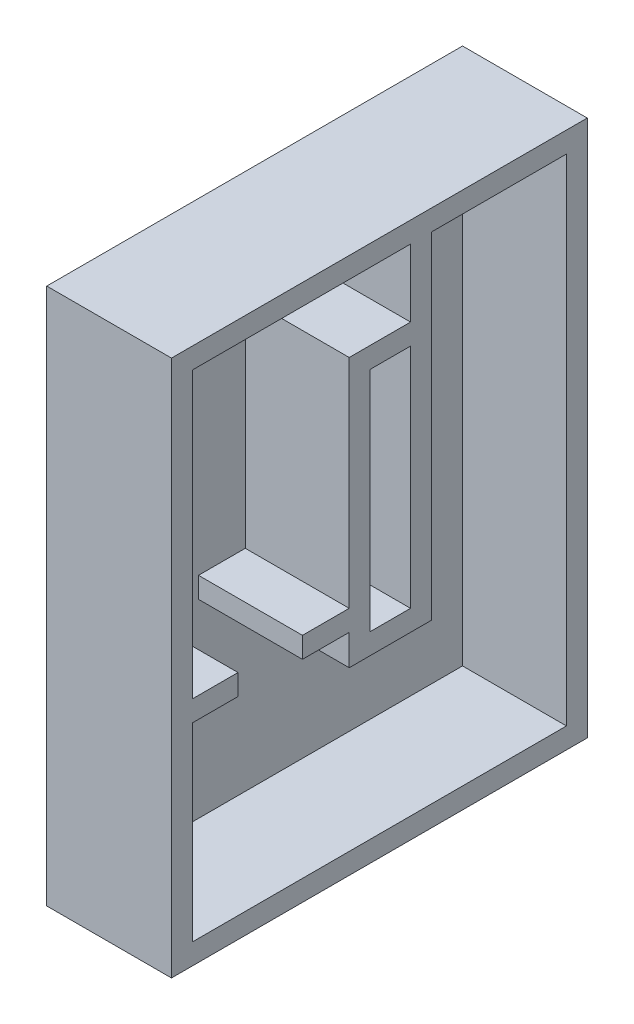
ISO-10303-21;
HEADER;
FILE_DESCRIPTION(('STEP AP214'),'2;1');
FILE_NAME('part.step','',(''),(''),'','','');
FILE_SCHEMA(('AUTOMOTIVE_DESIGN { 1 0 10303 214 1 1 1 1 }'));
ENDSEC;
DATA;
#1=APPLICATION_CONTEXT('core data for automotive mechanical design processes');
#2=APPLICATION_PROTOCOL_DEFINITION('international standard','automotive_design',2000,#1);
#3=PRODUCT_CONTEXT('',#1,'mechanical');
#4=PRODUCT('Part','Part','',(#3));
#5=PRODUCT_RELATED_PRODUCT_CATEGORY('part','',(#4));
#6=PRODUCT_DEFINITION_FORMATION('','',#4);
#7=PRODUCT_DEFINITION_CONTEXT('part definition',#1,'design');
#8=PRODUCT_DEFINITION('design','',#6,#7);
#9=PRODUCT_DEFINITION_SHAPE('','',#8);
#10=(LENGTH_UNIT() NAMED_UNIT(*) SI_UNIT(.MILLI.,.METRE.));
#11=(NAMED_UNIT(*) PLANE_ANGLE_UNIT() SI_UNIT($,.RADIAN.));
#12=(NAMED_UNIT(*) SI_UNIT($,.STERADIAN.) SOLID_ANGLE_UNIT());
#13=UNCERTAINTY_MEASURE_WITH_UNIT(LENGTH_MEASURE(1.E-05),#10,'distance_accuracy_value','');
#14=(GEOMETRIC_REPRESENTATION_CONTEXT(3) GLOBAL_UNCERTAINTY_ASSIGNED_CONTEXT((#13)) GLOBAL_UNIT_ASSIGNED_CONTEXT((#10,
#11,#12)) REPRESENTATION_CONTEXT('',''));
#15=CARTESIAN_POINT('',(0.,0.,0.));
#16=DIRECTION('',(0.,0.,1.));
#17=DIRECTION('',(1.,0.,0.));
#18=AXIS2_PLACEMENT_3D('',#15,#16,#17);
#19=CARTESIAN_POINT('',(2.,0.,0.));
#20=DIRECTION('',(1.,0.,0.));
#21=DIRECTION('',(0.,0.,-1.));
#22=AXIS2_PLACEMENT_3D('',#19,#20,#21);
#23=PLANE('',#22);
#24=DIRECTION('',(0.,1.,0.));
#25=VECTOR('',#24,1.);
#26=CARTESIAN_POINT('',(2.,-3.575,13.6));
#27=LINE('',#26,#25);
#28=CARTESIAN_POINT('',(2.,-5.575,13.6));
#29=VERTEX_POINT('',#28);
#30=CARTESIAN_POINT('',(2.,-3.575,13.6));
#31=VERTEX_POINT('',#30);
#32=EDGE_CURVE('E50',#29,#31,#27,.T.);
#33=ORIENTED_EDGE('',*,*,#32,.F.);
#34=DIRECTION('',(0.,0.,-1.));
#35=VECTOR('',#34,1.);
#36=CARTESIAN_POINT('',(2.,-5.575,18.));
#37=LINE('',#36,#35);
#38=CARTESIAN_POINT('',(2.,-5.575,18.));
#39=VERTEX_POINT('',#38);
#40=EDGE_CURVE('E235',#39,#29,#37,.T.);
#41=ORIENTED_EDGE('',*,*,#40,.F.);
#42=DIRECTION('',(0.,-1.,0.));
#43=VECTOR('',#42,1.);
#44=CARTESIAN_POINT('',(2.,25.825,18.));
#45=LINE('',#44,#43);
#46=CARTESIAN_POINT('',(2.,-23.825,18.));
#47=VERTEX_POINT('',#46);
#48=EDGE_CURVE('E363',#39,#47,#45,.T.);
#49=ORIENTED_EDGE('',*,*,#48,.T.);
#50=DIRECTION('',(0.,0.,-1.));
#51=VECTOR('',#50,1.);
#52=CARTESIAN_POINT('',(2.,-23.825,20.));
#53=LINE('',#52,#51);
#54=CARTESIAN_POINT('',(2.,-23.825,-18.));
#55=VERTEX_POINT('',#54);
#56=EDGE_CURVE('E368',#47,#55,#53,.T.);
#57=ORIENTED_EDGE('',*,*,#56,.T.);
#58=DIRECTION('',(0.,1.,0.));
#59=VECTOR('',#58,1.);
#60=CARTESIAN_POINT('',(2.,25.825,-18.));
#61=LINE('',#60,#59);
#62=CARTESIAN_POINT('',(2.,23.825,-18.));
#63=VERTEX_POINT('',#62);
#64=EDGE_CURVE('E346',#55,#63,#61,.T.);
#65=ORIENTED_EDGE('',*,*,#64,.T.);
#66=DIRECTION('',(0.,0.,1.));
#67=VECTOR('',#66,1.);
#68=CARTESIAN_POINT('',(2.,23.825,20.));
#69=LINE('',#68,#67);
#70=CARTESIAN_POINT('',(2.,23.825,-5.00000000000005));
#71=VERTEX_POINT('',#70);
#72=EDGE_CURVE('E360',#63,#71,#69,.T.);
#73=ORIENTED_EDGE('',*,*,#72,.T.);
#74=DIRECTION('',(0.,1.,0.));
#75=VECTOR('',#74,1.);
#76=CARTESIAN_POINT('',(2.,23.825,-5.00000000000005));
#77=LINE('',#76,#75);
#78=CARTESIAN_POINT('',(2.,-8.52500000000002,-5.00000000000003));
#79=VERTEX_POINT('',#78);
#80=EDGE_CURVE('E314',#79,#71,#77,.T.);
#81=ORIENTED_EDGE('',*,*,#80,.F.);
#82=DIRECTION('',(0.,0.,-1.));
#83=VECTOR('',#82,1.);
#84=CARTESIAN_POINT('',(2.,-8.52500000000002,2.90000000000001));
#85=LINE('',#84,#83);
#86=CARTESIAN_POINT('',(2.,-8.52500000000002,2.90000000000001));
#87=VERTEX_POINT('',#86);
#88=EDGE_CURVE('E311',#87,#79,#85,.T.);
#89=ORIENTED_EDGE('',*,*,#88,.F.);
#90=DIRECTION('',(0.,-1.,0.));
#91=VECTOR('',#90,1.);
#92=CARTESIAN_POINT('',(2.,-5.575,2.90000000000001));
#93=LINE('',#92,#91);
#94=CARTESIAN_POINT('',(2.,-5.575,2.90000000000001));
#95=VERTEX_POINT('',#94);
#96=EDGE_CURVE('E308',#95,#87,#93,.T.);
#97=ORIENTED_EDGE('',*,*,#96,.F.);
#98=DIRECTION('',(0.,0.,-1.));
#99=VECTOR('',#98,1.);
#100=CARTESIAN_POINT('',(2.,-5.575,7.40000000000001));
#101=LINE('',#100,#99);
#102=CARTESIAN_POINT('',(2.,-5.575,7.40000000000001));
#103=VERTEX_POINT('',#102);
#104=EDGE_CURVE('E305',#103,#95,#101,.T.);
#105=ORIENTED_EDGE('',*,*,#104,.F.);
#106=DIRECTION('',(0.,-1.,0.));
#107=VECTOR('',#106,1.);
#108=CARTESIAN_POINT('',(2.,-3.575,7.40000000000001));
#109=LINE('',#108,#107);
#110=CARTESIAN_POINT('',(2.,-3.575,7.40000000000001));
#111=VERTEX_POINT('',#110);
#112=EDGE_CURVE('E302',#111,#103,#109,.T.);
#113=ORIENTED_EDGE('',*,*,#112,.F.);
#114=DIRECTION('',(0.,0.,1.));
#115=VECTOR('',#114,1.);
#116=CARTESIAN_POINT('',(2.,-3.575,7.40000000000001));
#117=LINE('',#116,#115);
#118=CARTESIAN_POINT('',(2.,-3.575,2.90000000000001));
#119=VERTEX_POINT('',#118);
#120=EDGE_CURVE('E299',#119,#111,#117,.T.);
#121=ORIENTED_EDGE('',*,*,#120,.F.);
#122=DIRECTION('',(0.,-1.,0.));
#123=VECTOR('',#122,1.);
#124=CARTESIAN_POINT('',(2.,17.325,2.89999999999999));
#125=LINE('',#124,#123);
#126=CARTESIAN_POINT('',(2.,17.325,2.89999999999999));
#127=VERTEX_POINT('',#126);
#128=EDGE_CURVE('E296',#127,#119,#125,.T.);
#129=ORIENTED_EDGE('',*,*,#128,.F.);
#130=DIRECTION('',(0.,0.,1.));
#131=VECTOR('',#130,1.);
#132=CARTESIAN_POINT('',(2.,17.325,2.89999999999999));
#133=LINE('',#132,#131);
#134=CARTESIAN_POINT('',(2.,17.325,-3.00000000000005));
#135=VERTEX_POINT('',#134);
#136=EDGE_CURVE('E319',#135,#127,#133,.T.);
#137=ORIENTED_EDGE('',*,*,#136,.F.);
#138=DIRECTION('',(0.,-1.,0.));
#139=VECTOR('',#138,1.);
#140=CARTESIAN_POINT('',(2.,23.825,-3.00000000000005));
#141=LINE('',#140,#139);
#142=CARTESIAN_POINT('',(2.,23.825,-3.00000000000005));
#143=VERTEX_POINT('',#142);
#144=EDGE_CURVE('E316',#143,#135,#141,.T.);
#145=ORIENTED_EDGE('',*,*,#144,.F.);
#146=CARTESIAN_POINT('',(2.,23.825,18.));
#147=VERTEX_POINT('',#146);
#148=EDGE_CURVE('E349',#143,#147,#69,.T.);
#149=ORIENTED_EDGE('',*,*,#148,.T.);
#150=CARTESIAN_POINT('',(2.,-3.575,18.));
#151=VERTEX_POINT('',#150);
#152=EDGE_CURVE('E366',#147,#151,#45,.T.);
#153=ORIENTED_EDGE('',*,*,#152,.T.);
#154=DIRECTION('',(0.,0.,1.));
#155=VECTOR('',#154,1.);
#156=CARTESIAN_POINT('',(2.,-3.575,18.));
#157=LINE('',#156,#155);
#158=EDGE_CURVE('E55',#31,#151,#157,.T.);
#159=ORIENTED_EDGE('',*,*,#158,.F.);
#160=EDGE_LOOP('',(#33,#41,#49,#57,#65,#73,#81,#89,#97,#105,#113,#121,#129,#137,#145,#149,#153,#159));
#161=FACE_BOUND('',#160,.T.);
#162=ADVANCED_FACE('F35',(#161),#23,.T.);
#163=CARTESIAN_POINT('',(12.,25.825,18.));
#164=DIRECTION('',(0.,0.,-1.));
#165=DIRECTION('',(0.,1.,0.));
#166=AXIS2_PLACEMENT_3D('',#163,#164,#165);
#167=PLANE('',#166);
#168=ORIENTED_EDGE('',*,*,#48,.F.);
#169=DIRECTION('',(-1.,0.,0.));
#170=VECTOR('',#169,1.);
#171=CARTESIAN_POINT('',(46.645093447702,-5.575,18.));
#172=LINE('',#171,#170);
#173=CARTESIAN_POINT('',(12.,-5.575,18.));
#174=VERTEX_POINT('',#173);
#175=EDGE_CURVE('E238',#174,#39,#172,.T.);
#176=ORIENTED_EDGE('',*,*,#175,.F.);
#177=DIRECTION('',(0.,-1.,0.));
#178=VECTOR('',#177,1.);
#179=CARTESIAN_POINT('',(12.,25.825,18.));
#180=LINE('',#179,#178);
#181=CARTESIAN_POINT('',(12.,-23.825,18.));
#182=VERTEX_POINT('',#181);
#183=EDGE_CURVE('E378',#174,#182,#180,.T.);
#184=ORIENTED_EDGE('',*,*,#183,.T.);
#185=DIRECTION('',(-1.,0.,0.));
#186=VECTOR('',#185,1.);
#187=CARTESIAN_POINT('',(12.,-23.825,18.));
#188=LINE('',#187,#186);
#189=EDGE_CURVE('E358',#182,#47,#188,.T.);
#190=ORIENTED_EDGE('',*,*,#189,.T.);
#191=EDGE_LOOP('',(#168,#176,#184,#190));
#192=FACE_BOUND('',#191,.T.);
#193=ADVANCED_FACE('F433',(#192),#167,.T.);
#194=CARTESIAN_POINT('',(12.,23.825,18.));
#195=VERTEX_POINT('',#194);
#196=CARTESIAN_POINT('',(12.,-3.575,18.));
#197=VERTEX_POINT('',#196);
#198=EDGE_CURVE('E379',#195,#197,#180,.T.);
#199=ORIENTED_EDGE('',*,*,#198,.T.);
#200=DIRECTION('',(-1.,0.,0.));
#201=VECTOR('',#200,1.);
#202=CARTESIAN_POINT('',(46.645093447702,-3.575,18.));
#203=LINE('',#202,#201);
#204=EDGE_CURVE('E218',#197,#151,#203,.T.);
#205=ORIENTED_EDGE('',*,*,#204,.T.);
#206=ORIENTED_EDGE('',*,*,#152,.F.);
#207=DIRECTION('',(-1.,0.,0.));
#208=VECTOR('',#207,1.);
#209=CARTESIAN_POINT('',(12.,23.825,18.));
#210=LINE('',#209,#208);
#211=EDGE_CURVE('E354',#195,#147,#210,.T.);
#212=ORIENTED_EDGE('',*,*,#211,.F.);
#213=EDGE_LOOP('',(#199,#205,#206,#212));
#214=FACE_BOUND('',#213,.T.);
#215=ADVANCED_FACE('F439',(#214),#167,.T.);
#216=CARTESIAN_POINT('',(12.,23.825,20.));
#217=DIRECTION('',(0.,-1.,0.));
#218=DIRECTION('',(0.,0.,-1.));
#219=AXIS2_PLACEMENT_3D('',#216,#217,#218);
#220=PLANE('',#219);
#221=ORIENTED_EDGE('',*,*,#148,.F.);
#222=DIRECTION('',(-1.,0.,0.));
#223=VECTOR('',#222,1.);
#224=CARTESIAN_POINT('',(46.645093447702,23.825,-3.00000000000005));
#225=LINE('',#224,#223);
#226=CARTESIAN_POINT('',(12.,23.825,-3.00000000000005));
#227=VERTEX_POINT('',#226);
#228=EDGE_CURVE('E326',#227,#143,#225,.T.);
#229=ORIENTED_EDGE('',*,*,#228,.F.);
#230=DIRECTION('',(0.,0.,1.));
#231=VECTOR('',#230,1.);
#232=CARTESIAN_POINT('',(12.,23.825,20.));
#233=LINE('',#232,#231);
#234=EDGE_CURVE('E374',#227,#195,#233,.T.);
#235=ORIENTED_EDGE('',*,*,#234,.T.);
#236=ORIENTED_EDGE('',*,*,#211,.T.);
#237=EDGE_LOOP('',(#221,#229,#235,#236));
#238=FACE_BOUND('',#237,.T.);
#239=ADVANCED_FACE('F503',(#238),#220,.T.);
#240=CARTESIAN_POINT('',(12.,23.825,-18.));
#241=VERTEX_POINT('',#240);
#242=CARTESIAN_POINT('',(12.,23.825,-5.00000000000005));
#243=VERTEX_POINT('',#242);
#244=EDGE_CURVE('E375',#241,#243,#233,.T.);
#245=ORIENTED_EDGE('',*,*,#244,.T.);
#246=DIRECTION('',(-1.,0.,0.));
#247=VECTOR('',#246,1.);
#248=CARTESIAN_POINT('',(46.645093447702,23.825,-5.00000000000005));
#249=LINE('',#248,#247);
#250=EDGE_CURVE('E328',#243,#71,#249,.T.);
#251=ORIENTED_EDGE('',*,*,#250,.T.);
#252=ORIENTED_EDGE('',*,*,#72,.F.);
#253=DIRECTION('',(-1.,0.,0.));
#254=VECTOR('',#253,1.);
#255=CARTESIAN_POINT('',(12.,23.825,-18.));
#256=LINE('',#255,#254);
#257=EDGE_CURVE('E350',#241,#63,#256,.T.);
#258=ORIENTED_EDGE('',*,*,#257,.F.);
#259=EDGE_LOOP('',(#245,#251,#252,#258));
#260=FACE_BOUND('',#259,.T.);
#261=ADVANCED_FACE('F431',(#260),#220,.T.);
#262=CARTESIAN_POINT('',(12.,25.825,-20.));
#263=DIRECTION('',(0.,0.,1.));
#264=DIRECTION('',(0.,-1.,0.));
#265=AXIS2_PLACEMENT_3D('',#262,#263,#264);
#266=PLANE('',#265);
#267=DIRECTION('',(0.,1.,0.));
#268=VECTOR('',#267,1.);
#269=CARTESIAN_POINT('',(0.,25.825,-20.));
#270=LINE('',#269,#268);
#271=CARTESIAN_POINT('',(0.,-25.825,-20.));
#272=VERTEX_POINT('',#271);
#273=CARTESIAN_POINT('',(0.,25.825,-20.));
#274=VERTEX_POINT('',#273);
#275=EDGE_CURVE('E353',#272,#274,#270,.T.);
#276=ORIENTED_EDGE('',*,*,#275,.T.);
#277=DIRECTION('',(-1.,0.,0.));
#278=VECTOR('',#277,1.);
#279=CARTESIAN_POINT('',(12.,25.825,-20.));
#280=LINE('',#279,#278);
#281=CARTESIAN_POINT('',(12.,25.825,-20.));
#282=VERTEX_POINT('',#281);
#283=EDGE_CURVE('E11',#282,#274,#280,.T.);
#284=ORIENTED_EDGE('',*,*,#283,.F.);
#285=DIRECTION('',(0.,1.,0.));
#286=VECTOR('',#285,1.);
#287=CARTESIAN_POINT('',(12.,25.825,-20.));
#288=LINE('',#287,#286);
#289=CARTESIAN_POINT('',(12.,-25.825,-20.));
#290=VERTEX_POINT('',#289);
#291=EDGE_CURVE('E382',#290,#282,#288,.T.);
#292=ORIENTED_EDGE('',*,*,#291,.F.);
#293=DIRECTION('',(-1.,0.,0.));
#294=VECTOR('',#293,1.);
#295=CARTESIAN_POINT('',(12.,-25.825,-20.));
#296=LINE('',#295,#294);
#297=EDGE_CURVE('E392',#290,#272,#296,.T.);
#298=ORIENTED_EDGE('',*,*,#297,.T.);
#299=EDGE_LOOP('',(#276,#284,#292,#298));
#300=FACE_BOUND('',#299,.T.);
#301=ADVANCED_FACE('F37',(#300),#266,.F.);
#302=CARTESIAN_POINT('',(12.,25.825,20.));
#303=DIRECTION('',(0.,-1.,0.));
#304=DIRECTION('',(0.,0.,-1.));
#305=AXIS2_PLACEMENT_3D('',#302,#303,#304);
#306=PLANE('',#305);
#307=DIRECTION('',(0.,0.,1.));
#308=VECTOR('',#307,1.);
#309=CARTESIAN_POINT('',(0.,25.825,20.));
#310=LINE('',#309,#308);
#311=CARTESIAN_POINT('',(0.,25.825,20.));
#312=VERTEX_POINT('',#311);
#313=EDGE_CURVE('E395',#274,#312,#310,.T.);
#314=ORIENTED_EDGE('',*,*,#313,.T.);
#315=DIRECTION('',(-1.,0.,0.));
#316=VECTOR('',#315,1.);
#317=CARTESIAN_POINT('',(12.,25.825,20.));
#318=LINE('',#317,#316);
#319=CARTESIAN_POINT('',(12.,25.825,20.));
#320=VERTEX_POINT('',#319);
#321=EDGE_CURVE('E43',#320,#312,#318,.T.);
#322=ORIENTED_EDGE('',*,*,#321,.F.);
#323=DIRECTION('',(0.,0.,1.));
#324=VECTOR('',#323,1.);
#325=CARTESIAN_POINT('',(12.,25.825,20.));
#326=LINE('',#325,#324);
#327=EDGE_CURVE('E385',#282,#320,#326,.T.);
#328=ORIENTED_EDGE('',*,*,#327,.F.);
#329=ORIENTED_EDGE('',*,*,#283,.T.);
#330=EDGE_LOOP('',(#314,#322,#328,#329));
#331=FACE_BOUND('',#330,.T.);
#332=ADVANCED_FACE('F424',(#331),#306,.F.);
#333=CARTESIAN_POINT('',(12.,25.825,20.));
#334=DIRECTION('',(0.,0.,-1.));
#335=DIRECTION('',(0.,1.,0.));
#336=AXIS2_PLACEMENT_3D('',#333,#334,#335);
#337=PLANE('',#336);
#338=DIRECTION('',(0.,-1.,0.));
#339=VECTOR('',#338,1.);
#340=CARTESIAN_POINT('',(0.,25.825,20.));
#341=LINE('',#340,#339);
#342=CARTESIAN_POINT('',(0.,-25.825,20.));
#343=VERTEX_POINT('',#342);
#344=EDGE_CURVE('E397',#312,#343,#341,.T.);
#345=ORIENTED_EDGE('',*,*,#344,.T.);
#346=DIRECTION('',(-1.,0.,0.));
#347=VECTOR('',#346,1.);
#348=CARTESIAN_POINT('',(12.,-25.825,20.));
#349=LINE('',#348,#347);
#350=CARTESIAN_POINT('',(12.,-25.825,20.));
#351=VERTEX_POINT('',#350);
#352=EDGE_CURVE('E402',#351,#343,#349,.T.);
#353=ORIENTED_EDGE('',*,*,#352,.F.);
#354=DIRECTION('',(0.,-1.,0.));
#355=VECTOR('',#354,1.);
#356=CARTESIAN_POINT('',(12.,25.825,20.));
#357=LINE('',#356,#355);
#358=EDGE_CURVE('E388',#320,#351,#357,.T.);
#359=ORIENTED_EDGE('',*,*,#358,.F.);
#360=ORIENTED_EDGE('',*,*,#321,.T.);
#361=EDGE_LOOP('',(#345,#353,#359,#360));
#362=FACE_BOUND('',#361,.T.);
#363=ADVANCED_FACE('F409',(#362),#337,.F.);
#364=CARTESIAN_POINT('',(12.,-25.825,20.));
#365=DIRECTION('',(0.,1.,0.));
#366=DIRECTION('',(0.,0.,1.));
#367=AXIS2_PLACEMENT_3D('',#364,#365,#366);
#368=PLANE('',#367);
#369=DIRECTION('',(0.,0.,-1.));
#370=VECTOR('',#369,1.);
#371=CARTESIAN_POINT('',(0.,-25.825,20.));
#372=LINE('',#371,#370);
#373=EDGE_CURVE('E386',#343,#272,#372,.T.);
#374=ORIENTED_EDGE('',*,*,#373,.T.);
#375=ORIENTED_EDGE('',*,*,#297,.F.);
#376=DIRECTION('',(0.,0.,-1.));
#377=VECTOR('',#376,1.);
#378=CARTESIAN_POINT('',(12.,-25.825,20.));
#379=LINE('',#378,#377);
#380=EDGE_CURVE('E390',#351,#290,#379,.T.);
#381=ORIENTED_EDGE('',*,*,#380,.F.);
#382=ORIENTED_EDGE('',*,*,#352,.T.);
#383=EDGE_LOOP('',(#374,#375,#381,#382));
#384=FACE_BOUND('',#383,.T.);
#385=ADVANCED_FACE('F418',(#384),#368,.F.);
#386=CARTESIAN_POINT('',(12.,0.,0.));
#387=DIRECTION('',(1.,0.,0.));
#388=DIRECTION('',(0.,0.,-1.));
#389=AXIS2_PLACEMENT_3D('',#386,#387,#388);
#390=PLANE('',#389);
#391=DIRECTION('',(0.,1.,0.));
#392=VECTOR('',#391,1.);
#393=CARTESIAN_POINT('',(12.,25.825,-18.));
#394=LINE('',#393,#392);
#395=CARTESIAN_POINT('',(12.,-23.825,-18.));
#396=VERTEX_POINT('',#395);
#397=EDGE_CURVE('E372',#396,#241,#394,.T.);
#398=ORIENTED_EDGE('',*,*,#397,.F.);
#399=DIRECTION('',(0.,0.,-1.));
#400=VECTOR('',#399,1.);
#401=CARTESIAN_POINT('',(12.,-23.825,20.));
#402=LINE('',#401,#400);
#403=EDGE_CURVE('E359',#182,#396,#402,.T.);
#404=ORIENTED_EDGE('',*,*,#403,.F.);
#405=ORIENTED_EDGE('',*,*,#183,.F.);
#406=DIRECTION('',(0.,0.,-1.));
#407=VECTOR('',#406,1.);
#408=CARTESIAN_POINT('',(12.,-5.575,18.));
#409=LINE('',#408,#407);
#410=CARTESIAN_POINT('',(12.,-5.575,13.6));
#411=VERTEX_POINT('',#410);
#412=EDGE_CURVE('E221',#174,#411,#409,.T.);
#413=ORIENTED_EDGE('',*,*,#412,.T.);
#414=DIRECTION('',(0.,1.,0.));
#415=VECTOR('',#414,1.);
#416=CARTESIAN_POINT('',(12.,-3.575,13.6));
#417=LINE('',#416,#415);
#418=CARTESIAN_POINT('',(12.,-3.575,13.6));
#419=VERTEX_POINT('',#418);
#420=EDGE_CURVE('E210',#411,#419,#417,.T.);
#421=ORIENTED_EDGE('',*,*,#420,.T.);
#422=DIRECTION('',(0.,0.,1.));
#423=VECTOR('',#422,1.);
#424=CARTESIAN_POINT('',(12.,-3.575,18.));
#425=LINE('',#424,#423);
#426=EDGE_CURVE('E216',#419,#197,#425,.T.);
#427=ORIENTED_EDGE('',*,*,#426,.T.);
#428=ORIENTED_EDGE('',*,*,#198,.F.);
#429=ORIENTED_EDGE('',*,*,#234,.F.);
#430=DIRECTION('',(0.,-1.,0.));
#431=VECTOR('',#430,1.);
#432=CARTESIAN_POINT('',(12.,23.825,-3.00000000000005));
#433=LINE('',#432,#431);
#434=CARTESIAN_POINT('',(12.,17.325,-3.00000000000005));
#435=VERTEX_POINT('',#434);
#436=EDGE_CURVE('E252',#227,#435,#433,.T.);
#437=ORIENTED_EDGE('',*,*,#436,.T.);
#438=DIRECTION('',(0.,0.,1.));
#439=VECTOR('',#438,1.);
#440=CARTESIAN_POINT('',(12.,17.325,2.89999999999999));
#441=LINE('',#440,#439);
#442=CARTESIAN_POINT('',(12.,17.325,2.89999999999999));
#443=VERTEX_POINT('',#442);
#444=EDGE_CURVE('E249',#435,#443,#441,.T.);
#445=ORIENTED_EDGE('',*,*,#444,.T.);
#446=DIRECTION('',(0.,-1.,0.));
#447=VECTOR('',#446,1.);
#448=CARTESIAN_POINT('',(12.,17.325,2.89999999999999));
#449=LINE('',#448,#447);
#450=CARTESIAN_POINT('',(12.,-3.575,2.90000000000001));
#451=VERTEX_POINT('',#450);
#452=EDGE_CURVE('E273',#443,#451,#449,.T.);
#453=ORIENTED_EDGE('',*,*,#452,.T.);
#454=DIRECTION('',(0.,0.,1.));
#455=VECTOR('',#454,1.);
#456=CARTESIAN_POINT('',(12.,-3.575,7.40000000000001));
#457=LINE('',#456,#455);
#458=CARTESIAN_POINT('',(12.,-3.575,7.40000000000001));
#459=VERTEX_POINT('',#458);
#460=EDGE_CURVE('E270',#451,#459,#457,.T.);
#461=ORIENTED_EDGE('',*,*,#460,.T.);
#462=DIRECTION('',(0.,-1.,0.));
#463=VECTOR('',#462,1.);
#464=CARTESIAN_POINT('',(12.,-3.575,7.40000000000001));
#465=LINE('',#464,#463);
#466=CARTESIAN_POINT('',(12.,-5.575,7.40000000000001));
#467=VERTEX_POINT('',#466);
#468=EDGE_CURVE('E267',#459,#467,#465,.T.);
#469=ORIENTED_EDGE('',*,*,#468,.T.);
#470=DIRECTION('',(0.,0.,-1.));
#471=VECTOR('',#470,1.);
#472=CARTESIAN_POINT('',(12.,-5.575,7.40000000000001));
#473=LINE('',#472,#471);
#474=CARTESIAN_POINT('',(12.,-5.575,2.90000000000001));
#475=VERTEX_POINT('',#474);
#476=EDGE_CURVE('E264',#467,#475,#473,.T.);
#477=ORIENTED_EDGE('',*,*,#476,.T.);
#478=DIRECTION('',(0.,-1.,0.));
#479=VECTOR('',#478,1.);
#480=CARTESIAN_POINT('',(12.,-5.575,2.90000000000001));
#481=LINE('',#480,#479);
#482=CARTESIAN_POINT('',(12.,-8.52500000000002,2.90000000000001));
#483=VERTEX_POINT('',#482);
#484=EDGE_CURVE('E261',#475,#483,#481,.T.);
#485=ORIENTED_EDGE('',*,*,#484,.T.);
#486=DIRECTION('',(0.,0.,-1.));
#487=VECTOR('',#486,1.);
#488=CARTESIAN_POINT('',(12.,-8.52500000000002,2.90000000000001));
#489=LINE('',#488,#487);
#490=CARTESIAN_POINT('',(12.,-8.52500000000002,-5.00000000000003));
#491=VERTEX_POINT('',#490);
#492=EDGE_CURVE('E258',#483,#491,#489,.T.);
#493=ORIENTED_EDGE('',*,*,#492,.T.);
#494=DIRECTION('',(0.,1.,0.));
#495=VECTOR('',#494,1.);
#496=CARTESIAN_POINT('',(12.,23.825,-5.00000000000005));
#497=LINE('',#496,#495);
#498=EDGE_CURVE('E255',#491,#243,#497,.T.);
#499=ORIENTED_EDGE('',*,*,#498,.T.);
#500=ORIENTED_EDGE('',*,*,#244,.F.);
#501=EDGE_LOOP('',(#398,#404,#405,#413,#421,#427,#428,#429,#437,#445,#453,#461,#469,#477,#485,
#493,#499,#500));
#502=FACE_BOUND('',#501,.T.);
#503=ORIENTED_EDGE('',*,*,#291,.T.);
#504=ORIENTED_EDGE('',*,*,#327,.T.);
#505=ORIENTED_EDGE('',*,*,#358,.T.);
#506=ORIENTED_EDGE('',*,*,#380,.T.);
#507=EDGE_LOOP('',(#503,#504,#505,#506));
#508=FACE_BOUND('',#507,.T.);
#509=DIRECTION('',(0.,-1.,0.));
#510=VECTOR('',#509,1.);
#511=CARTESIAN_POINT('',(12.,15.325,0.899999999999993));
#512=LINE('',#511,#510);
#513=CARTESIAN_POINT('',(12.,15.325,0.899999999999993));
#514=VERTEX_POINT('',#513);
#515=CARTESIAN_POINT('',(12.,-6.52500000000002,0.900000000000008));
#516=VERTEX_POINT('',#515);
#517=EDGE_CURVE('E246',#514,#516,#512,.T.);
#518=ORIENTED_EDGE('',*,*,#517,.F.);
#519=DIRECTION('',(0.,0.,1.));
#520=VECTOR('',#519,1.);
#521=CARTESIAN_POINT('',(12.,15.325,0.899999999999993));
#522=LINE('',#521,#520);
#523=CARTESIAN_POINT('',(12.,15.325,-3.00000000000005));
#524=VERTEX_POINT('',#523);
#525=EDGE_CURVE('E343',#524,#514,#522,.T.);
#526=ORIENTED_EDGE('',*,*,#525,.F.);
#527=DIRECTION('',(0.,1.,0.));
#528=VECTOR('',#527,1.);
#529=CARTESIAN_POINT('',(12.,15.325,-3.00000000000005));
#530=LINE('',#529,#528);
#531=CARTESIAN_POINT('',(12.,-6.52500000000002,-3.00000000000003));
#532=VERTEX_POINT('',#531);
#533=EDGE_CURVE('E228',#532,#524,#530,.T.);
#534=ORIENTED_EDGE('',*,*,#533,.F.);
#535=DIRECTION('',(0.,0.,-1.));
#536=VECTOR('',#535,1.);
#537=CARTESIAN_POINT('',(12.,-6.52500000000002,0.900000000000008));
#538=LINE('',#537,#536);
#539=EDGE_CURVE('E231',#516,#532,#538,.T.);
#540=ORIENTED_EDGE('',*,*,#539,.F.);
#541=EDGE_LOOP('',(#518,#526,#534,#540));
#542=FACE_BOUND('',#541,.T.);
#543=ADVANCED_FACE('F225',(#502,#508,#542),#390,.T.);
#544=CARTESIAN_POINT('',(0.,0.,0.));
#545=DIRECTION('',(1.,0.,0.));
#546=DIRECTION('',(0.,0.,-1.));
#547=AXIS2_PLACEMENT_3D('',#544,#545,#546);
#548=PLANE('',#547);
#549=ORIENTED_EDGE('',*,*,#275,.F.);
#550=ORIENTED_EDGE('',*,*,#373,.F.);
#551=ORIENTED_EDGE('',*,*,#344,.F.);
#552=ORIENTED_EDGE('',*,*,#313,.F.);
#553=EDGE_LOOP('',(#549,#550,#551,#552));
#554=FACE_BOUND('',#553,.T.);
#555=ADVANCED_FACE('F415',(#554),#548,.F.);
#556=CARTESIAN_POINT('',(12.,25.825,-18.));
#557=DIRECTION('',(0.,0.,1.));
#558=DIRECTION('',(0.,-1.,0.));
#559=AXIS2_PLACEMENT_3D('',#556,#557,#558);
#560=PLANE('',#559);
#561=ORIENTED_EDGE('',*,*,#64,.F.);
#562=DIRECTION('',(-1.,0.,0.));
#563=VECTOR('',#562,1.);
#564=CARTESIAN_POINT('',(12.,-23.825,-18.));
#565=LINE('',#564,#563);
#566=EDGE_CURVE('E355',#396,#55,#565,.T.);
#567=ORIENTED_EDGE('',*,*,#566,.F.);
#568=ORIENTED_EDGE('',*,*,#397,.T.);
#569=ORIENTED_EDGE('',*,*,#257,.T.);
#570=EDGE_LOOP('',(#561,#567,#568,#569));
#571=FACE_BOUND('',#570,.T.);
#572=ADVANCED_FACE('F475',(#571),#560,.T.);
#573=CARTESIAN_POINT('',(12.,-23.825,20.));
#574=DIRECTION('',(0.,1.,0.));
#575=DIRECTION('',(0.,0.,1.));
#576=AXIS2_PLACEMENT_3D('',#573,#574,#575);
#577=PLANE('',#576);
#578=ORIENTED_EDGE('',*,*,#56,.F.);
#579=ORIENTED_EDGE('',*,*,#189,.F.);
#580=ORIENTED_EDGE('',*,*,#403,.T.);
#581=ORIENTED_EDGE('',*,*,#566,.T.);
#582=EDGE_LOOP('',(#578,#579,#580,#581));
#583=FACE_BOUND('',#582,.T.);
#584=ADVANCED_FACE('F531',(#583),#577,.T.);
#585=CARTESIAN_POINT('',(46.645093447702,17.325,2.89999999999999));
#586=DIRECTION('',(0.,-1.,0.));
#587=DIRECTION('',(0.,0.,-1.));
#588=AXIS2_PLACEMENT_3D('',#585,#586,#587);
#589=PLANE('',#588);
#590=ORIENTED_EDGE('',*,*,#444,.F.);
#591=DIRECTION('',(-1.,0.,0.));
#592=VECTOR('',#591,1.);
#593=CARTESIAN_POINT('',(46.645093447702,17.325,-3.00000000000005));
#594=LINE('',#593,#592);
#595=EDGE_CURVE('E324',#435,#135,#594,.T.);
#596=ORIENTED_EDGE('',*,*,#595,.T.);
#597=ORIENTED_EDGE('',*,*,#136,.T.);
#598=DIRECTION('',(-1.,0.,0.));
#599=VECTOR('',#598,1.);
#600=CARTESIAN_POINT('',(46.645093447702,17.325,2.89999999999999));
#601=LINE('',#600,#599);
#602=EDGE_CURVE('E321',#443,#127,#601,.T.);
#603=ORIENTED_EDGE('',*,*,#602,.F.);
#604=EDGE_LOOP('',(#590,#596,#597,#603));
#605=FACE_BOUND('',#604,.T.);
#606=ADVANCED_FACE('F536',(#605),#589,.F.);
#607=CARTESIAN_POINT('',(46.645093447702,23.825,-3.00000000000005));
#608=DIRECTION('',(0.,0.,-1.));
#609=DIRECTION('',(0.,1.,0.));
#610=AXIS2_PLACEMENT_3D('',#607,#608,#609);
#611=PLANE('',#610);
#612=ORIENTED_EDGE('',*,*,#436,.F.);
#613=ORIENTED_EDGE('',*,*,#228,.T.);
#614=ORIENTED_EDGE('',*,*,#144,.T.);
#615=ORIENTED_EDGE('',*,*,#595,.F.);
#616=EDGE_LOOP('',(#612,#613,#614,#615));
#617=FACE_BOUND('',#616,.T.);
#618=ADVANCED_FACE('F572',(#617),#611,.F.);
#619=CARTESIAN_POINT('',(46.645093447702,23.825,-5.00000000000005));
#620=DIRECTION('',(0.,0.,1.));
#621=DIRECTION('',(1.,0.,0.));
#622=AXIS2_PLACEMENT_3D('',#619,#620,#621);
#623=PLANE('',#622);
#624=ORIENTED_EDGE('',*,*,#498,.F.);
#625=DIRECTION('',(-1.,0.,0.));
#626=VECTOR('',#625,1.);
#627=CARTESIAN_POINT('',(46.645093447702,-8.52500000000002,-5.00000000000003));
#628=LINE('',#627,#626);
#629=EDGE_CURVE('E331',#491,#79,#628,.T.);
#630=ORIENTED_EDGE('',*,*,#629,.T.);
#631=ORIENTED_EDGE('',*,*,#80,.T.);
#632=ORIENTED_EDGE('',*,*,#250,.F.);
#633=EDGE_LOOP('',(#624,#630,#631,#632));
#634=FACE_BOUND('',#633,.T.);
#635=ADVANCED_FACE('F581',(#634),#623,.F.);
#636=CARTESIAN_POINT('',(46.645093447702,-8.52500000000002,2.90000000000001));
#637=DIRECTION('',(0.,1.,0.));
#638=DIRECTION('',(0.,0.,1.));
#639=AXIS2_PLACEMENT_3D('',#636,#637,#638);
#640=PLANE('',#639);
#641=ORIENTED_EDGE('',*,*,#492,.F.);
#642=DIRECTION('',(-1.,0.,0.));
#643=VECTOR('',#642,1.);
#644=CARTESIAN_POINT('',(46.645093447702,-8.52500000000002,2.90000000000001));
#645=LINE('',#644,#643);
#646=EDGE_CURVE('E333',#483,#87,#645,.T.);
#647=ORIENTED_EDGE('',*,*,#646,.T.);
#648=ORIENTED_EDGE('',*,*,#88,.T.);
#649=ORIENTED_EDGE('',*,*,#629,.F.);
#650=EDGE_LOOP('',(#641,#647,#648,#649));
#651=FACE_BOUND('',#650,.T.);
#652=ADVANCED_FACE('F590',(#651),#640,.F.);
#653=CARTESIAN_POINT('',(46.645093447702,-5.575,2.90000000000001));
#654=DIRECTION('',(0.,0.,-1.));
#655=DIRECTION('',(0.,1.,0.));
#656=AXIS2_PLACEMENT_3D('',#653,#654,#655);
#657=PLANE('',#656);
#658=ORIENTED_EDGE('',*,*,#484,.F.);
#659=DIRECTION('',(-1.,0.,0.));
#660=VECTOR('',#659,1.);
#661=CARTESIAN_POINT('',(46.645093447702,-5.575,2.90000000000001));
#662=LINE('',#661,#660);
#663=EDGE_CURVE('E335',#475,#95,#662,.T.);
#664=ORIENTED_EDGE('',*,*,#663,.T.);
#665=ORIENTED_EDGE('',*,*,#96,.T.);
#666=ORIENTED_EDGE('',*,*,#646,.F.);
#667=EDGE_LOOP('',(#658,#664,#665,#666));
#668=FACE_BOUND('',#667,.T.);
#669=ADVANCED_FACE('F602',(#668),#657,.F.);
#670=CARTESIAN_POINT('',(46.645093447702,-5.575,7.40000000000001));
#671=DIRECTION('',(0.,1.,0.));
#672=DIRECTION('',(0.,0.,1.));
#673=AXIS2_PLACEMENT_3D('',#670,#671,#672);
#674=PLANE('',#673);
#675=ORIENTED_EDGE('',*,*,#476,.F.);
#676=DIRECTION('',(-1.,0.,0.));
#677=VECTOR('',#676,1.);
#678=CARTESIAN_POINT('',(46.645093447702,-5.575,7.40000000000001));
#679=LINE('',#678,#677);
#680=EDGE_CURVE('E337',#467,#103,#679,.T.);
#681=ORIENTED_EDGE('',*,*,#680,.T.);
#682=ORIENTED_EDGE('',*,*,#104,.T.);
#683=ORIENTED_EDGE('',*,*,#663,.F.);
#684=EDGE_LOOP('',(#675,#681,#682,#683));
#685=FACE_BOUND('',#684,.T.);
#686=ADVANCED_FACE('F611',(#685),#674,.F.);
#687=CARTESIAN_POINT('',(46.645093447702,-3.575,7.40000000000001));
#688=DIRECTION('',(0.,0.,-1.));
#689=DIRECTION('',(-1.,0.,0.));
#690=AXIS2_PLACEMENT_3D('',#687,#688,#689);
#691=PLANE('',#690);
#692=ORIENTED_EDGE('',*,*,#468,.F.);
#693=DIRECTION('',(-1.,0.,0.));
#694=VECTOR('',#693,1.);
#695=CARTESIAN_POINT('',(46.645093447702,-3.575,7.40000000000001));
#696=LINE('',#695,#694);
#697=EDGE_CURVE('E339',#459,#111,#696,.T.);
#698=ORIENTED_EDGE('',*,*,#697,.T.);
#699=ORIENTED_EDGE('',*,*,#112,.T.);
#700=ORIENTED_EDGE('',*,*,#680,.F.);
#701=EDGE_LOOP('',(#692,#698,#699,#700));
#702=FACE_BOUND('',#701,.T.);
#703=ADVANCED_FACE('F620',(#702),#691,.F.);
#704=CARTESIAN_POINT('',(46.645093447702,-3.575,7.40000000000001));
#705=DIRECTION('',(0.,-1.,0.));
#706=DIRECTION('',(0.,0.,-1.));
#707=AXIS2_PLACEMENT_3D('',#704,#705,#706);
#708=PLANE('',#707);
#709=ORIENTED_EDGE('',*,*,#460,.F.);
#710=DIRECTION('',(-1.,0.,0.));
#711=VECTOR('',#710,1.);
#712=CARTESIAN_POINT('',(46.645093447702,-3.575,2.90000000000001));
#713=LINE('',#712,#711);
#714=EDGE_CURVE('E341',#451,#119,#713,.T.);
#715=ORIENTED_EDGE('',*,*,#714,.T.);
#716=ORIENTED_EDGE('',*,*,#120,.T.);
#717=ORIENTED_EDGE('',*,*,#697,.F.);
#718=EDGE_LOOP('',(#709,#715,#716,#717));
#719=FACE_BOUND('',#718,.T.);
#720=ADVANCED_FACE('F629',(#719),#708,.F.);
#721=CARTESIAN_POINT('',(46.645093447702,17.325,2.89999999999999));
#722=DIRECTION('',(0.,0.,-1.));
#723=DIRECTION('',(0.,1.,0.));
#724=AXIS2_PLACEMENT_3D('',#721,#722,#723);
#725=PLANE('',#724);
#726=ORIENTED_EDGE('',*,*,#452,.F.);
#727=ORIENTED_EDGE('',*,*,#602,.T.);
#728=ORIENTED_EDGE('',*,*,#128,.T.);
#729=ORIENTED_EDGE('',*,*,#714,.F.);
#730=EDGE_LOOP('',(#726,#727,#728,#729));
#731=FACE_BOUND('',#730,.T.);
#732=ADVANCED_FACE('F638',(#731),#725,.F.);
#733=CARTESIAN_POINT('',(46.645093447702,15.325,0.899999999999993));
#734=DIRECTION('',(0.,-1.,0.));
#735=DIRECTION('',(0.,0.,-1.));
#736=AXIS2_PLACEMENT_3D('',#733,#734,#735);
#737=PLANE('',#736);
#738=DIRECTION('',(-1.,0.,0.));
#739=VECTOR('',#738,1.);
#740=CARTESIAN_POINT('',(46.645093447702,15.325,-3.00000000000005));
#741=LINE('',#740,#739);
#742=CARTESIAN_POINT('',(2.,15.325,-3.00000000000005));
#743=VERTEX_POINT('',#742);
#744=EDGE_CURVE('E287',#524,#743,#741,.T.);
#745=ORIENTED_EDGE('',*,*,#744,.F.);
#746=ORIENTED_EDGE('',*,*,#525,.T.);
#747=DIRECTION('',(-1.,0.,0.));
#748=VECTOR('',#747,1.);
#749=CARTESIAN_POINT('',(46.645093447702,15.325,0.899999999999993));
#750=LINE('',#749,#748);
#751=CARTESIAN_POINT('',(2.,15.325,0.899999999999993));
#752=VERTEX_POINT('',#751);
#753=EDGE_CURVE('E284',#514,#752,#750,.T.);
#754=ORIENTED_EDGE('',*,*,#753,.T.);
#755=DIRECTION('',(0.,0.,1.));
#756=VECTOR('',#755,1.);
#757=CARTESIAN_POINT('',(2.,15.325,0.899999999999993));
#758=LINE('',#757,#756);
#759=EDGE_CURVE('E282',#743,#752,#758,.T.);
#760=ORIENTED_EDGE('',*,*,#759,.F.);
#761=EDGE_LOOP('',(#745,#746,#754,#760));
#762=FACE_BOUND('',#761,.T.);
#763=ADVANCED_FACE('F463',(#762),#737,.T.);
#764=CARTESIAN_POINT('',(46.645093447702,15.325,-3.00000000000005));
#765=DIRECTION('',(0.,0.,1.));
#766=DIRECTION('',(0.,-1.,0.));
#767=AXIS2_PLACEMENT_3D('',#764,#765,#766);
#768=PLANE('',#767);
#769=DIRECTION('',(-1.,0.,0.));
#770=VECTOR('',#769,1.);
#771=CARTESIAN_POINT('',(46.645093447702,-6.52500000000002,-3.00000000000003));
#772=LINE('',#771,#770);
#773=CARTESIAN_POINT('',(2.,-6.52500000000002,-3.00000000000003));
#774=VERTEX_POINT('',#773);
#775=EDGE_CURVE('E290',#532,#774,#772,.T.);
#776=ORIENTED_EDGE('',*,*,#775,.F.);
#777=ORIENTED_EDGE('',*,*,#533,.T.);
#778=ORIENTED_EDGE('',*,*,#744,.T.);
#779=DIRECTION('',(0.,1.,0.));
#780=VECTOR('',#779,1.);
#781=CARTESIAN_POINT('',(2.,15.325,-3.00000000000005));
#782=LINE('',#781,#780);
#783=EDGE_CURVE('E280',#774,#743,#782,.T.);
#784=ORIENTED_EDGE('',*,*,#783,.F.);
#785=EDGE_LOOP('',(#776,#777,#778,#784));
#786=FACE_BOUND('',#785,.T.);
#787=ADVANCED_FACE('F469',(#786),#768,.T.);
#788=CARTESIAN_POINT('',(46.645093447702,-6.52500000000002,0.900000000000008));
#789=DIRECTION('',(0.,1.,0.));
#790=DIRECTION('',(0.,0.,1.));
#791=AXIS2_PLACEMENT_3D('',#788,#789,#790);
#792=PLANE('',#791);
#793=DIRECTION('',(-1.,0.,0.));
#794=VECTOR('',#793,1.);
#795=CARTESIAN_POINT('',(46.645093447702,-6.52500000000002,0.900000000000008));
#796=LINE('',#795,#794);
#797=CARTESIAN_POINT('',(2.,-6.52500000000002,0.900000000000008));
#798=VERTEX_POINT('',#797);
#799=EDGE_CURVE('E293',#516,#798,#796,.T.);
#800=ORIENTED_EDGE('',*,*,#799,.F.);
#801=ORIENTED_EDGE('',*,*,#539,.T.);
#802=ORIENTED_EDGE('',*,*,#775,.T.);
#803=DIRECTION('',(0.,0.,-1.));
#804=VECTOR('',#803,1.);
#805=CARTESIAN_POINT('',(2.,-6.52500000000002,0.900000000000008));
#806=LINE('',#805,#804);
#807=EDGE_CURVE('E278',#798,#774,#806,.T.);
#808=ORIENTED_EDGE('',*,*,#807,.F.);
#809=EDGE_LOOP('',(#800,#801,#802,#808));
#810=FACE_BOUND('',#809,.T.);
#811=ADVANCED_FACE('F454',(#810),#792,.T.);
#812=CARTESIAN_POINT('',(46.645093447702,15.325,0.899999999999993));
#813=DIRECTION('',(0.,0.,-1.));
#814=DIRECTION('',(0.,1.,0.));
#815=AXIS2_PLACEMENT_3D('',#812,#813,#814);
#816=PLANE('',#815);
#817=ORIENTED_EDGE('',*,*,#753,.F.);
#818=ORIENTED_EDGE('',*,*,#517,.T.);
#819=ORIENTED_EDGE('',*,*,#799,.T.);
#820=DIRECTION('',(0.,-1.,0.));
#821=VECTOR('',#820,1.);
#822=CARTESIAN_POINT('',(2.,15.325,0.899999999999993));
#823=LINE('',#822,#821);
#824=EDGE_CURVE('E276',#752,#798,#823,.T.);
#825=ORIENTED_EDGE('',*,*,#824,.F.);
#826=EDGE_LOOP('',(#817,#818,#819,#825));
#827=FACE_BOUND('',#826,.T.);
#828=ADVANCED_FACE('F446',(#827),#816,.T.);
#829=ORIENTED_EDGE('',*,*,#759,.T.);
#830=ORIENTED_EDGE('',*,*,#824,.T.);
#831=ORIENTED_EDGE('',*,*,#807,.T.);
#832=ORIENTED_EDGE('',*,*,#783,.T.);
#833=EDGE_LOOP('',(#829,#830,#831,#832));
#834=FACE_BOUND('',#833,.T.);
#835=ADVANCED_FACE('F435',(#834),#23,.T.);
#836=CARTESIAN_POINT('',(46.645093447702,-5.575,18.));
#837=DIRECTION('',(0.,1.,0.));
#838=DIRECTION('',(0.,0.,1.));
#839=AXIS2_PLACEMENT_3D('',#836,#837,#838);
#840=PLANE('',#839);
#841=ORIENTED_EDGE('',*,*,#412,.F.);
#842=ORIENTED_EDGE('',*,*,#175,.T.);
#843=ORIENTED_EDGE('',*,*,#40,.T.);
#844=DIRECTION('',(-1.,0.,0.));
#845=VECTOR('',#844,1.);
#846=CARTESIAN_POINT('',(46.645093447702,-5.575,13.6));
#847=LINE('',#846,#845);
#848=EDGE_CURVE('E241',#411,#29,#847,.T.);
#849=ORIENTED_EDGE('',*,*,#848,.F.);
#850=EDGE_LOOP('',(#841,#842,#843,#849));
#851=FACE_BOUND('',#850,.T.);
#852=ADVANCED_FACE('F445',(#851),#840,.F.);
#853=CARTESIAN_POINT('',(46.645093447702,-3.575,13.6));
#854=DIRECTION('',(0.,0.,1.));
#855=DIRECTION('',(1.,0.,0.));
#856=AXIS2_PLACEMENT_3D('',#853,#854,#855);
#857=PLANE('',#856);
#858=ORIENTED_EDGE('',*,*,#420,.F.);
#859=ORIENTED_EDGE('',*,*,#848,.T.);
#860=ORIENTED_EDGE('',*,*,#32,.T.);
#861=DIRECTION('',(-1.,0.,0.));
#862=VECTOR('',#861,1.);
#863=CARTESIAN_POINT('',(46.645093447702,-3.575,13.6));
#864=LINE('',#863,#862);
#865=EDGE_CURVE('E206',#419,#31,#864,.T.);
#866=ORIENTED_EDGE('',*,*,#865,.F.);
#867=EDGE_LOOP('',(#858,#859,#860,#866));
#868=FACE_BOUND('',#867,.T.);
#869=ADVANCED_FACE('F208',(#868),#857,.F.);
#870=CARTESIAN_POINT('',(46.645093447702,-3.575,18.));
#871=DIRECTION('',(0.,-1.,0.));
#872=DIRECTION('',(0.,0.,-1.));
#873=AXIS2_PLACEMENT_3D('',#870,#871,#872);
#874=PLANE('',#873);
#875=ORIENTED_EDGE('',*,*,#426,.F.);
#876=ORIENTED_EDGE('',*,*,#865,.T.);
#877=ORIENTED_EDGE('',*,*,#158,.T.);
#878=ORIENTED_EDGE('',*,*,#204,.F.);
#879=EDGE_LOOP('',(#875,#876,#877,#878));
#880=FACE_BOUND('',#879,.T.);
#881=ADVANCED_FACE('F217',(#880),#874,.F.);
#882=CLOSED_SHELL('',(#162,#193,#215,#239,#261,#301,#332,#363,#385,#543,#555,#572,#584,#606,
#618,#635,#652,#669,#686,#703,#720,#732,#763,#787,#811,#828,#835,#852,#869,#881));
#883=MANIFOLD_SOLID_BREP('B2',#882);
#884=ADVANCED_BREP_SHAPE_REPRESENTATION('',(#18,#883),#14);
#885=SHAPE_DEFINITION_REPRESENTATION(#9,#884);
ENDSEC;
END-ISO-10303-21;
